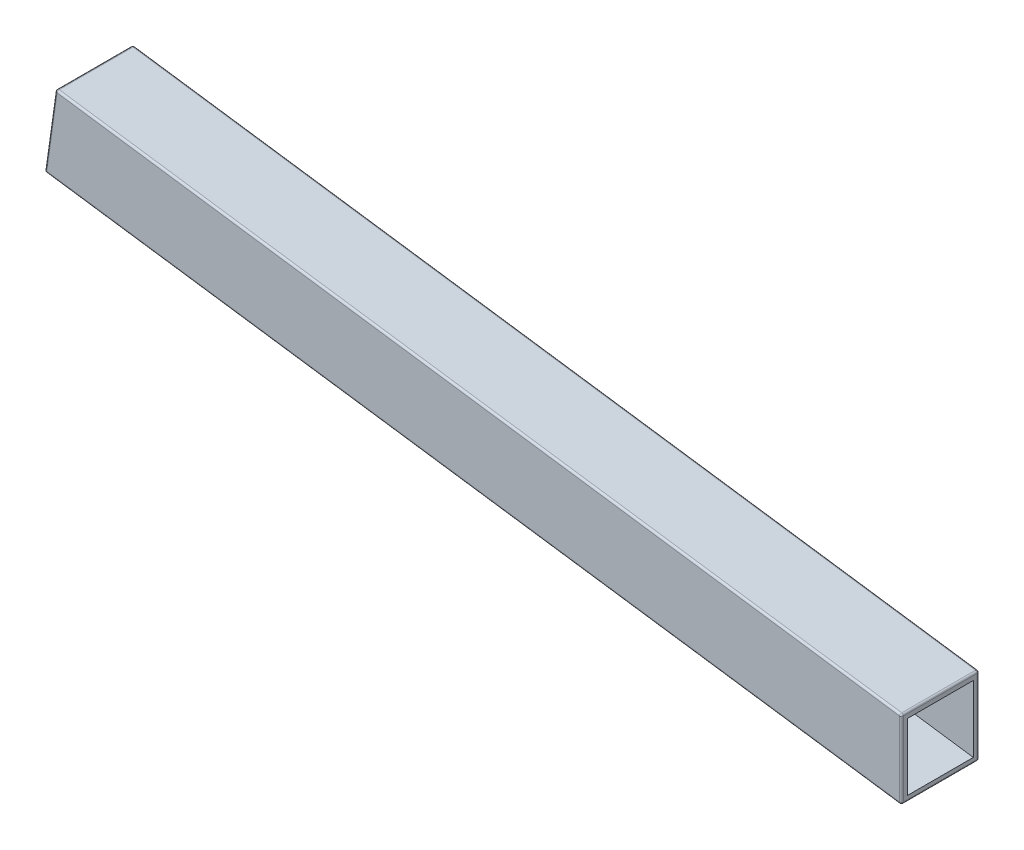
ISO-10303-21;
HEADER;
FILE_DESCRIPTION(('STEP AP214'),'2;1');
FILE_NAME('part.step','',(''),(''),'','','');
FILE_SCHEMA(('AUTOMOTIVE_DESIGN { 1 0 10303 214 1 1 1 1 }'));
ENDSEC;
DATA;
#1=APPLICATION_CONTEXT('core data for automotive mechanical design processes');
#2=APPLICATION_PROTOCOL_DEFINITION('international standard','automotive_design',2000,#1);
#3=PRODUCT_CONTEXT('',#1,'mechanical');
#4=PRODUCT('Part','Part','',(#3));
#5=PRODUCT_RELATED_PRODUCT_CATEGORY('part','',(#4));
#6=PRODUCT_DEFINITION_FORMATION('','',#4);
#7=PRODUCT_DEFINITION_CONTEXT('part definition',#1,'design');
#8=PRODUCT_DEFINITION('design','',#6,#7);
#9=PRODUCT_DEFINITION_SHAPE('','',#8);
#10=(LENGTH_UNIT() NAMED_UNIT(*) SI_UNIT(.MILLI.,.METRE.));
#11=(NAMED_UNIT(*) PLANE_ANGLE_UNIT() SI_UNIT($,.RADIAN.));
#12=(NAMED_UNIT(*) SI_UNIT($,.STERADIAN.) SOLID_ANGLE_UNIT());
#13=UNCERTAINTY_MEASURE_WITH_UNIT(LENGTH_MEASURE(1.E-05),#10,'distance_accuracy_value','');
#14=(GEOMETRIC_REPRESENTATION_CONTEXT(3) GLOBAL_UNCERTAINTY_ASSIGNED_CONTEXT((#13)) GLOBAL_UNIT_ASSIGNED_CONTEXT((#10,
#11,#12)) REPRESENTATION_CONTEXT('',''));
#15=CARTESIAN_POINT('',(0.,0.,0.));
#16=DIRECTION('',(0.,0.,1.));
#17=DIRECTION('',(1.,0.,0.));
#18=AXIS2_PLACEMENT_3D('',#15,#16,#17);
#19=CARTESIAN_POINT('',(0.,40.3931029007447,40.));
#20=DIRECTION('',(-1.,0.,0.));
#21=DIRECTION('',(0.,-1.,0.));
#22=AXIS2_PLACEMENT_3D('',#19,#20,#21);
#23=PLANE('',#22);
#24=DIRECTION('',(0.,1.,0.));
#25=VECTOR('',#24,1.);
#26=CARTESIAN_POINT('',(0.,40.3931029007447,39.));
#27=LINE('',#26,#25);
#28=CARTESIAN_POINT('',(0.,39.5238161629285,39.));
#29=VERTEX_POINT('',#28);
#30=CARTESIAN_POINT('',(0.,1.15036840722101,39.));
#31=VERTEX_POINT('',#30);
#32=EDGE_CURVE('E213',#29,#31,#27,.F.);
#33=ORIENTED_EDGE('',*,*,#32,.T.);
#34=DIRECTION('',(0.,0.,-1.));
#35=VECTOR('',#34,1.);
#36=CARTESIAN_POINT('',(0.,1.15036840722101,40.));
#37=LINE('',#36,#35);
#38=CARTESIAN_POINT('',(0.,1.15036840722101,1.));
#39=VERTEX_POINT('',#38);
#40=EDGE_CURVE('E219',#31,#39,#37,.T.);
#41=ORIENTED_EDGE('',*,*,#40,.T.);
#42=DIRECTION('',(0.,1.,0.));
#43=VECTOR('',#42,1.);
#44=CARTESIAN_POINT('',(0.,40.3931029007447,1.));
#45=LINE('',#44,#43);
#46=CARTESIAN_POINT('',(0.,39.5238161629285,1.));
#47=VERTEX_POINT('',#46);
#48=EDGE_CURVE('E217',#39,#47,#45,.T.);
#49=ORIENTED_EDGE('',*,*,#48,.T.);
#50=DIRECTION('',(0.,0.,-1.));
#51=VECTOR('',#50,1.);
#52=CARTESIAN_POINT('',(0.,39.5238161629285,40.));
#53=LINE('',#52,#51);
#54=EDGE_CURVE('E215',#47,#29,#53,.F.);
#55=ORIENTED_EDGE('',*,*,#54,.T.);
#56=EDGE_LOOP('',(#33,#41,#49,#55));
#57=FACE_BOUND('',#56,.T.);
#58=DIRECTION('',(0.,0.,-1.));
#59=VECTOR('',#58,1.);
#60=CARTESIAN_POINT('',(0.,37.3636201831886,40.));
#61=LINE('',#60,#59);
#62=CARTESIAN_POINT('',(0.,37.3636201831886,37.));
#63=VERTEX_POINT('',#62);
#64=CARTESIAN_POINT('',(0.,37.3636201831886,3.));
#65=VERTEX_POINT('',#64);
#66=EDGE_CURVE('E189',#63,#65,#61,.T.);
#67=ORIENTED_EDGE('',*,*,#66,.T.);
#68=DIRECTION('',(0.,-1.,0.));
#69=VECTOR('',#68,1.);
#70=CARTESIAN_POINT('',(0.,40.3931029007447,3.));
#71=LINE('',#70,#69);
#72=CARTESIAN_POINT('',(0.,3.02948271755558,3.));
#73=VERTEX_POINT('',#72);
#74=EDGE_CURVE('E192',#65,#73,#71,.T.);
#75=ORIENTED_EDGE('',*,*,#74,.T.);
#76=DIRECTION('',(0.,0.,1.));
#77=VECTOR('',#76,1.);
#78=CARTESIAN_POINT('',(0.,3.02948271755557,40.));
#79=LINE('',#78,#77);
#80=CARTESIAN_POINT('',(0.,3.02948271755557,37.));
#81=VERTEX_POINT('',#80);
#82=EDGE_CURVE('E184',#73,#81,#79,.T.);
#83=ORIENTED_EDGE('',*,*,#82,.T.);
#84=DIRECTION('',(0.,1.,0.));
#85=VECTOR('',#84,1.);
#86=CARTESIAN_POINT('',(0.,40.3931029007447,37.));
#87=LINE('',#86,#85);
#88=EDGE_CURVE('E160',#81,#63,#87,.T.);
#89=ORIENTED_EDGE('',*,*,#88,.T.);
#90=EDGE_LOOP('',(#67,#75,#83,#89));
#91=FACE_BOUND('',#90,.T.);
#92=ADVANCED_FACE('F39',(#57,#91),#23,.F.);
#93=CARTESIAN_POINT('',(-435.717950246291,101.629267323174,40.));
#94=DIRECTION('',(-0.139173100960065,-0.99026806874157,0.));
#95=DIRECTION('',(0.99026806874157,-0.139173100960065,0.));
#96=AXIS2_PLACEMENT_3D('',#93,#94,#95);
#97=PLANE('',#96);
#98=DIRECTION('',(0.,0.,-1.));
#99=VECTOR('',#98,1.);
#100=CARTESIAN_POINT('',(-0.860826899039935,40.5140842316701,40.));
#101=LINE('',#100,#99);
#102=CARTESIAN_POINT('',(-0.860826899039935,40.5140842316701,39.));
#103=VERTEX_POINT('',#102);
#104=CARTESIAN_POINT('',(-0.860826899039935,40.5140842316701,1.));
#105=VERTEX_POINT('',#104);
#106=EDGE_CURVE('E235',#103,#105,#101,.T.);
#107=ORIENTED_EDGE('',*,*,#106,.T.);
#108=DIRECTION('',(-0.99026806874157,0.139173100960065,0.));
#109=VECTOR('',#108,1.);
#110=CARTESIAN_POINT('',(-435.717950246291,101.629267323174,1.));
#111=LINE('',#110,#109);
#112=CARTESIAN_POINT('',(-434.727682177549,101.490094222213,1.));
#113=VERTEX_POINT('',#112);
#114=EDGE_CURVE('E238',#105,#113,#111,.T.);
#115=ORIENTED_EDGE('',*,*,#114,.T.);
#116=DIRECTION('',(0.,0.,-1.));
#117=VECTOR('',#116,1.);
#118=CARTESIAN_POINT('',(-434.727682177549,101.490094222213,40.));
#119=LINE('',#118,#117);
#120=CARTESIAN_POINT('',(-434.727682177549,101.490094222213,39.));
#121=VERTEX_POINT('',#120);
#122=EDGE_CURVE('E233',#113,#121,#119,.F.);
#123=ORIENTED_EDGE('',*,*,#122,.T.);
#124=DIRECTION('',(-0.99026806874157,0.139173100960065,0.));
#125=VECTOR('',#124,1.);
#126=CARTESIAN_POINT('',(-435.717950246291,101.629267323174,39.));
#127=LINE('',#126,#125);
#128=EDGE_CURVE('E231',#121,#103,#127,.F.);
#129=ORIENTED_EDGE('',*,*,#128,.T.);
#130=EDGE_LOOP('',(#107,#115,#123,#129));
#131=FACE_BOUND('',#130,.T.);
#132=ADVANCED_FACE('F322',(#131),#97,.F.);
#133=CARTESIAN_POINT('',(-441.284874284694,62.0185445735107,40.));
#134=DIRECTION('',(0.99026806874157,-0.139173100960066,0.));
#135=DIRECTION('',(0.139173100960066,0.99026806874157,0.));
#136=AXIS2_PLACEMENT_3D('',#133,#134,#135);
#137=PLANE('',#136);
#138=DIRECTION('',(-0.139173100960066,-0.99026806874157,0.));
#139=VECTOR('',#138,1.);
#140=CARTESIAN_POINT('',(-441.284874284694,62.0185445735107,1.));
#141=LINE('',#140,#139);
#142=CARTESIAN_POINT('',(-435.857123347251,100.638999254432,1.));
#143=VERTEX_POINT('',#142);
#144=CARTESIAN_POINT('',(-441.145701183733,63.0088126422523,1.));
#145=VERTEX_POINT('',#144);
#146=EDGE_CURVE('E208',#143,#145,#141,.T.);
#147=ORIENTED_EDGE('',*,*,#146,.T.);
#148=DIRECTION('',(0.,0.,-1.));
#149=VECTOR('',#148,1.);
#150=CARTESIAN_POINT('',(-441.145701183733,63.0088126422523,40.));
#151=LINE('',#150,#149);
#152=CARTESIAN_POINT('',(-441.145701183733,63.0088126422523,39.));
#153=VERTEX_POINT('',#152);
#154=EDGE_CURVE('E210',#145,#153,#151,.F.);
#155=ORIENTED_EDGE('',*,*,#154,.T.);
#156=DIRECTION('',(-0.139173100960066,-0.99026806874157,0.));
#157=VECTOR('',#156,1.);
#158=CARTESIAN_POINT('',(-441.284874284694,62.0185445735107,39.));
#159=LINE('',#158,#157);
#160=CARTESIAN_POINT('',(-435.857123347251,100.638999254432,39.));
#161=VERTEX_POINT('',#160);
#162=EDGE_CURVE('E204',#153,#161,#159,.F.);
#163=ORIENTED_EDGE('',*,*,#162,.T.);
#164=DIRECTION('',(0.,0.,-1.));
#165=VECTOR('',#164,1.);
#166=CARTESIAN_POINT('',(-435.857123347251,100.638999254432,40.));
#167=LINE('',#166,#165);
#168=EDGE_CURVE('E206',#161,#143,#167,.T.);
#169=ORIENTED_EDGE('',*,*,#168,.T.);
#170=EDGE_LOOP('',(#147,#155,#163,#169));
#171=FACE_BOUND('',#170,.T.);
#172=DIRECTION('',(0.,0.,1.));
#173=VECTOR('',#172,1.);
#174=CARTESIAN_POINT('',(-440.867354981813,64.9893487797355,37.));
#175=LINE('',#174,#173);
#176=CARTESIAN_POINT('',(-440.867354981813,64.9893487797355,3.));
#177=VERTEX_POINT('',#176);
#178=CARTESIAN_POINT('',(-440.867354981813,64.9893487797355,37.));
#179=VERTEX_POINT('',#178);
#180=EDGE_CURVE('E168',#177,#179,#175,.T.);
#181=ORIENTED_EDGE('',*,*,#180,.F.);
#182=DIRECTION('',(-0.139173100960066,-0.99026806874157,0.));
#183=VECTOR('',#182,1.);
#184=CARTESIAN_POINT('',(-440.867354981813,64.9893487797355,3.));
#185=LINE('',#184,#183);
#186=CARTESIAN_POINT('',(-436.135469549171,98.6584631169489,3.));
#187=VERTEX_POINT('',#186);
#188=EDGE_CURVE('E173',#187,#177,#185,.T.);
#189=ORIENTED_EDGE('',*,*,#188,.F.);
#190=DIRECTION('',(0.,0.,-1.));
#191=VECTOR('',#190,1.);
#192=CARTESIAN_POINT('',(-436.135469549171,98.6584631169489,3.));
#193=LINE('',#192,#191);
#194=CARTESIAN_POINT('',(-436.135469549171,98.6584631169489,37.));
#195=VERTEX_POINT('',#194);
#196=EDGE_CURVE('E177',#195,#187,#193,.T.);
#197=ORIENTED_EDGE('',*,*,#196,.F.);
#198=DIRECTION('',(0.139173100960066,0.99026806874157,0.));
#199=VECTOR('',#198,1.);
#200=CARTESIAN_POINT('',(-436.135469549171,98.6584631169489,37.));
#201=LINE('',#200,#199);
#202=EDGE_CURVE('E157',#179,#195,#201,.T.);
#203=ORIENTED_EDGE('',*,*,#202,.F.);
#204=EDGE_LOOP('',(#181,#189,#197,#203));
#205=FACE_BOUND('',#204,.T.);
#206=ADVANCED_FACE('F175',(#171,#205),#137,.F.);
#207=CARTESIAN_POINT('',(0.,0.,40.));
#208=DIRECTION('',(0.139173100960065,0.99026806874157,0.));
#209=DIRECTION('',(-0.99026806874157,0.139173100960065,0.));
#210=AXIS2_PLACEMENT_3D('',#207,#208,#209);
#211=PLANE('',#210);
#212=DIRECTION('',(0.,0.,-1.));
#213=VECTOR('',#212,1.);
#214=CARTESIAN_POINT('',(-440.294606215952,61.8793714725506,40.));
#215=LINE('',#214,#213);
#216=CARTESIAN_POINT('',(-440.294606215952,61.8793714725506,39.));
#217=VERTEX_POINT('',#216);
#218=CARTESIAN_POINT('',(-440.294606215952,61.8793714725506,1.));
#219=VERTEX_POINT('',#218);
#220=EDGE_CURVE('E199',#217,#219,#215,.T.);
#221=ORIENTED_EDGE('',*,*,#220,.T.);
#222=DIRECTION('',(0.99026806874157,-0.139173100960065,0.));
#223=VECTOR('',#222,1.);
#224=CARTESIAN_POINT('',(0.,0.,1.));
#225=LINE('',#224,#223);
#226=CARTESIAN_POINT('',(-1.13917310096006,0.160100338479439,1.));
#227=VERTEX_POINT('',#226);
#228=EDGE_CURVE('E202',#219,#227,#225,.T.);
#229=ORIENTED_EDGE('',*,*,#228,.T.);
#230=DIRECTION('',(0.,0.,-1.));
#231=VECTOR('',#230,1.);
#232=CARTESIAN_POINT('',(-1.13917310096006,0.160100338479439,40.));
#233=LINE('',#232,#231);
#234=CARTESIAN_POINT('',(-1.13917310096006,0.160100338479439,39.));
#235=VERTEX_POINT('',#234);
#236=EDGE_CURVE('E197',#227,#235,#233,.F.);
#237=ORIENTED_EDGE('',*,*,#236,.T.);
#238=DIRECTION('',(0.99026806874157,-0.139173100960065,0.));
#239=VECTOR('',#238,1.);
#240=CARTESIAN_POINT('',(0.,0.,39.));
#241=LINE('',#240,#239);
#242=EDGE_CURVE('E195',#235,#217,#241,.F.);
#243=ORIENTED_EDGE('',*,*,#242,.T.);
#244=EDGE_LOOP('',(#221,#229,#237,#243));
#245=FACE_BOUND('',#244,.T.);
#246=ADVANCED_FACE('F438',(#245),#211,.F.);
#247=CARTESIAN_POINT('',(0.,0.,40.));
#248=DIRECTION('',(0.,0.,-1.));
#249=DIRECTION('',(-1.,0.,0.));
#250=AXIS2_PLACEMENT_3D('',#247,#248,#249);
#251=PLANE('',#250);
#252=DIRECTION('',(-0.139173100960066,-0.99026806874157,0.));
#253=VECTOR('',#252,1.);
#254=CARTESIAN_POINT('',(-440.294606215952,61.8793714725509,40.));
#255=LINE('',#254,#253);
#256=CARTESIAN_POINT('',(-434.866855278509,100.499826153472,40.));
#257=VERTEX_POINT('',#256);
#258=CARTESIAN_POINT('',(-440.155433114992,62.8696395412922,40.));
#259=VERTEX_POINT('',#258);
#260=EDGE_CURVE('E48',#257,#259,#255,.T.);
#261=ORIENTED_EDGE('',*,*,#260,.T.);
#262=DIRECTION('',(0.99026806874157,-0.139173100960065,0.));
#263=VECTOR('',#262,1.);
#264=CARTESIAN_POINT('',(0.139173100960065,0.99026806874157,40.));
#265=LINE('',#264,#263);
#266=CARTESIAN_POINT('',(-1.,1.15036840722101,40.));
#267=VERTEX_POINT('',#266);
#268=EDGE_CURVE('E11',#259,#267,#265,.T.);
#269=ORIENTED_EDGE('',*,*,#268,.T.);
#270=DIRECTION('',(0.,1.,0.));
#271=VECTOR('',#270,1.);
#272=CARTESIAN_POINT('',(-1.,0.,40.));
#273=LINE('',#272,#271);
#274=CARTESIAN_POINT('',(-1.,39.5238161629285,40.));
#275=VERTEX_POINT('',#274);
#276=EDGE_CURVE('E240',#267,#275,#273,.T.);
#277=ORIENTED_EDGE('',*,*,#276,.T.);
#278=DIRECTION('',(-0.99026806874157,0.139173100960065,0.));
#279=VECTOR('',#278,1.);
#280=CARTESIAN_POINT('',(5.42775093744255,38.6204546809213,40.));
#281=LINE('',#280,#279);
#282=EDGE_CURVE('E59',#275,#257,#281,.T.);
#283=ORIENTED_EDGE('',*,*,#282,.T.);
#284=EDGE_LOOP('',(#261,#269,#277,#283));
#285=FACE_BOUND('',#284,.T.);
#286=ADVANCED_FACE('F435',(#285),#251,.F.);
#287=CARTESIAN_POINT('',(0.,0.,0.));
#288=DIRECTION('',(0.,0.,-1.));
#289=DIRECTION('',(-1.,0.,0.));
#290=AXIS2_PLACEMENT_3D('',#287,#288,#289);
#291=PLANE('',#290);
#292=DIRECTION('',(0.99026806874157,-0.139173100960065,0.));
#293=VECTOR('',#292,1.);
#294=CARTESIAN_POINT('',(-441.145701183734,63.0088126422523,0.));
#295=LINE('',#294,#293);
#296=CARTESIAN_POINT('',(-1.,1.150368407221,0.));
#297=VERTEX_POINT('',#296);
#298=CARTESIAN_POINT('',(-440.155433114992,62.8696395412922,0.));
#299=VERTEX_POINT('',#298);
#300=EDGE_CURVE('E226',#297,#299,#295,.F.);
#301=ORIENTED_EDGE('',*,*,#300,.T.);
#302=DIRECTION('',(-0.139173100960066,-0.99026806874157,0.));
#303=VECTOR('',#302,1.);
#304=CARTESIAN_POINT('',(-434.727682177549,101.490094222213,0.));
#305=LINE('',#304,#303);
#306=CARTESIAN_POINT('',(-434.866855278509,100.499826153472,0.));
#307=VERTEX_POINT('',#306);
#308=EDGE_CURVE('E228',#299,#307,#305,.F.);
#309=ORIENTED_EDGE('',*,*,#308,.T.);
#310=DIRECTION('',(-0.99026806874157,0.139173100960065,0.));
#311=VECTOR('',#310,1.);
#312=CARTESIAN_POINT('',(-0.139173100959955,39.4028348320032,0.));
#313=LINE('',#312,#311);
#314=CARTESIAN_POINT('',(-1.,39.5238161629285,0.));
#315=VERTEX_POINT('',#314);
#316=EDGE_CURVE('E222',#307,#315,#313,.F.);
#317=ORIENTED_EDGE('',*,*,#316,.T.);
#318=DIRECTION('',(0.,1.,0.));
#319=VECTOR('',#318,1.);
#320=CARTESIAN_POINT('',(-1.,0.,0.));
#321=LINE('',#320,#319);
#322=EDGE_CURVE('E224',#315,#297,#321,.F.);
#323=ORIENTED_EDGE('',*,*,#322,.T.);
#324=EDGE_LOOP('',(#301,#309,#317,#323));
#325=FACE_BOUND('',#324,.T.);
#326=ADVANCED_FACE('F437',(#325),#291,.T.);
#327=CARTESIAN_POINT('',(0.417519302880254,2.97080420622443,3.));
#328=DIRECTION('',(0.,0.,-1.));
#329=DIRECTION('',(0.,1.,0.));
#330=AXIS2_PLACEMENT_3D('',#327,#328,#329);
#331=PLANE('',#330);
#332=DIRECTION('',(-0.99026806874157,0.139173100960066,0.));
#333=VECTOR('',#332,1.);
#334=CARTESIAN_POINT('',(5.1494047355225,36.6399185434378,3.));
#335=LINE('',#334,#333);
#336=EDGE_CURVE('E182',#65,#187,#335,.T.);
#337=ORIENTED_EDGE('',*,*,#336,.T.);
#338=ORIENTED_EDGE('',*,*,#188,.T.);
#339=DIRECTION('',(-0.99026806874157,0.139173100960066,0.));
#340=VECTOR('',#339,1.);
#341=CARTESIAN_POINT('',(0.417519302880254,2.97080420622443,3.));
#342=LINE('',#341,#340);
#343=EDGE_CURVE('E164',#73,#177,#342,.T.);
#344=ORIENTED_EDGE('',*,*,#343,.F.);
#345=ORIENTED_EDGE('',*,*,#74,.F.);
#346=EDGE_LOOP('',(#337,#338,#344,#345));
#347=FACE_BOUND('',#346,.T.);
#348=ADVANCED_FACE('F316',(#347),#331,.F.);
#349=CARTESIAN_POINT('',(5.1494047355225,36.6399185434378,3.));
#350=DIRECTION('',(0.139173100960066,0.99026806874157,0.));
#351=DIRECTION('',(-0.99026806874157,0.139173100960066,0.));
#352=AXIS2_PLACEMENT_3D('',#349,#350,#351);
#353=PLANE('',#352);
#354=DIRECTION('',(-0.99026806874157,0.139173100960066,0.));
#355=VECTOR('',#354,1.);
#356=CARTESIAN_POINT('',(5.1494047355225,36.6399185434378,37.));
#357=LINE('',#356,#355);
#358=EDGE_CURVE('E163',#63,#195,#357,.T.);
#359=ORIENTED_EDGE('',*,*,#358,.T.);
#360=ORIENTED_EDGE('',*,*,#196,.T.);
#361=ORIENTED_EDGE('',*,*,#336,.F.);
#362=ORIENTED_EDGE('',*,*,#66,.F.);
#363=EDGE_LOOP('',(#359,#360,#361,#362));
#364=FACE_BOUND('',#363,.T.);
#365=ADVANCED_FACE('F319',(#364),#353,.F.);
#366=CARTESIAN_POINT('',(5.1494047355225,36.6399185434378,37.));
#367=DIRECTION('',(0.,0.,1.));
#368=DIRECTION('',(0.,-1.,0.));
#369=AXIS2_PLACEMENT_3D('',#366,#367,#368);
#370=PLANE('',#369);
#371=DIRECTION('',(-0.99026806874157,0.139173100960066,0.));
#372=VECTOR('',#371,1.);
#373=CARTESIAN_POINT('',(0.417519302880254,2.97080420622443,37.));
#374=LINE('',#373,#372);
#375=EDGE_CURVE('E152',#81,#179,#374,.T.);
#376=ORIENTED_EDGE('',*,*,#375,.T.);
#377=ORIENTED_EDGE('',*,*,#202,.T.);
#378=ORIENTED_EDGE('',*,*,#358,.F.);
#379=ORIENTED_EDGE('',*,*,#88,.F.);
#380=EDGE_LOOP('',(#376,#377,#378,#379));
#381=FACE_BOUND('',#380,.T.);
#382=ADVANCED_FACE('F154',(#381),#370,.F.);
#383=CARTESIAN_POINT('',(0.417519302880254,2.97080420622443,37.));
#384=DIRECTION('',(-0.139173100960066,-0.99026806874157,0.));
#385=DIRECTION('',(0.99026806874157,-0.139173100960066,0.));
#386=AXIS2_PLACEMENT_3D('',#383,#384,#385);
#387=PLANE('',#386);
#388=ORIENTED_EDGE('',*,*,#343,.T.);
#389=ORIENTED_EDGE('',*,*,#180,.T.);
#390=ORIENTED_EDGE('',*,*,#375,.F.);
#391=ORIENTED_EDGE('',*,*,#82,.F.);
#392=EDGE_LOOP('',(#388,#389,#390,#391));
#393=FACE_BOUND('',#392,.T.);
#394=ADVANCED_FACE('F169',(#393),#387,.F.);
#395=CARTESIAN_POINT('',(-1.,39.5238161629285,40.));
#396=DIRECTION('',(0.,0.,-1.));
#397=DIRECTION('',(-1.,0.,0.));
#398=AXIS2_PLACEMENT_3D('',#395,#396,#397);
#399=CYLINDRICAL_SURFACE('',#398,1.);
#400=CARTESIAN_POINT('',(-1.,39.5238161629285,39.));
#401=DIRECTION('',(0.,0.,1.));
#402=DIRECTION('',(1.,0.,0.));
#403=AXIS2_PLACEMENT_3D('',#400,#401,#402);
#404=CIRCLE('',#403,1.);
#405=EDGE_CURVE('E43',#29,#103,#404,.T.);
#406=ORIENTED_EDGE('',*,*,#405,.F.);
#407=ORIENTED_EDGE('',*,*,#54,.F.);
#408=CARTESIAN_POINT('',(-1.,39.5238161629285,1.));
#409=DIRECTION('',(0.,0.,-1.));
#410=DIRECTION('',(-1.,0.,0.));
#411=AXIS2_PLACEMENT_3D('',#408,#409,#410);
#412=CIRCLE('',#411,1.);
#413=EDGE_CURVE('E304',#105,#47,#412,.T.);
#414=ORIENTED_EDGE('',*,*,#413,.F.);
#415=ORIENTED_EDGE('',*,*,#106,.F.);
#416=EDGE_LOOP('',(#406,#407,#414,#415));
#417=FACE_BOUND('',#416,.T.);
#418=ADVANCED_FACE('F41',(#417),#399,.T.);
#419=CARTESIAN_POINT('',(-1.,39.5238161629285,39.));
#420=DIRECTION('',(0.,0.,1.));
#421=DIRECTION('',(1.,0.,0.));
#422=AXIS2_PLACEMENT_3D('',#419,#420,#421);
#423=SPHERICAL_SURFACE('',#422,1.);
#424=CARTESIAN_POINT('',(-1.,39.5238161629285,39.));
#425=DIRECTION('',(0.,1.,0.));
#426=DIRECTION('',(-1.,0.,0.));
#427=AXIS2_PLACEMENT_3D('',#424,#425,#426);
#428=CIRCLE('',#427,1.);
#429=EDGE_CURVE('E299',#29,#275,#428,.F.);
#430=ORIENTED_EDGE('',*,*,#429,.F.);
#431=ORIENTED_EDGE('',*,*,#405,.T.);
#432=CARTESIAN_POINT('',(-1.,39.5238161629285,39.));
#433=DIRECTION('',(0.99026806874157,-0.139173100960066,0.));
#434=DIRECTION('',(0.139173100960065,0.99026806874157,0.));
#435=AXIS2_PLACEMENT_3D('',#432,#433,#434);
#436=CIRCLE('',#435,1.);
#437=EDGE_CURVE('E302',#275,#103,#436,.F.);
#438=ORIENTED_EDGE('',*,*,#437,.F.);
#439=EDGE_LOOP('',(#430,#431,#438));
#440=FACE_BOUND('',#439,.T.);
#441=ADVANCED_FACE('F402',(#440),#423,.T.);
#442=CARTESIAN_POINT('',(-1.,39.5238161629285,1.));
#443=DIRECTION('',(0.,0.,1.));
#444=DIRECTION('',(1.,0.,0.));
#445=AXIS2_PLACEMENT_3D('',#442,#443,#444);
#446=SPHERICAL_SURFACE('',#445,1.);
#447=CARTESIAN_POINT('',(-1.,39.5238161629285,1.));
#448=DIRECTION('',(0.99026806874157,-0.139173100960063,0.));
#449=DIRECTION('',(0.139173100960063,0.990268068741571,0.));
#450=AXIS2_PLACEMENT_3D('',#447,#448,#449);
#451=CIRCLE('',#450,1.);
#452=EDGE_CURVE('E293',#105,#315,#451,.F.);
#453=ORIENTED_EDGE('',*,*,#452,.F.);
#454=ORIENTED_EDGE('',*,*,#413,.T.);
#455=CARTESIAN_POINT('',(-1.,39.5238161629285,1.));
#456=DIRECTION('',(0.,1.,0.));
#457=DIRECTION('',(0.,0.,1.));
#458=AXIS2_PLACEMENT_3D('',#455,#456,#457);
#459=CIRCLE('',#458,1.);
#460=EDGE_CURVE('E296',#315,#47,#459,.F.);
#461=ORIENTED_EDGE('',*,*,#460,.F.);
#462=EDGE_LOOP('',(#453,#454,#461));
#463=FACE_BOUND('',#462,.T.);
#464=ADVANCED_FACE('F399',(#463),#446,.T.);
#465=CARTESIAN_POINT('',(5.42775093744255,38.6204546809213,39.));
#466=DIRECTION('',(-0.99026806874157,0.139173100960065,0.));
#467=DIRECTION('',(-0.139173100960065,-0.99026806874157,0.));
#468=AXIS2_PLACEMENT_3D('',#465,#466,#467);
#469=CYLINDRICAL_SURFACE('',#468,1.);
#470=ORIENTED_EDGE('',*,*,#437,.T.);
#471=ORIENTED_EDGE('',*,*,#128,.F.);
#472=CARTESIAN_POINT('',(-434.866855278509,100.499826153472,39.));
#473=DIRECTION('',(-0.99026806874157,0.139173100960066,0.));
#474=DIRECTION('',(-0.139173100960066,-0.99026806874157,0.));
#475=AXIS2_PLACEMENT_3D('',#472,#473,#474);
#476=CIRCLE('',#475,1.);
#477=EDGE_CURVE('E287',#257,#121,#476,.T.);
#478=ORIENTED_EDGE('',*,*,#477,.F.);
#479=ORIENTED_EDGE('',*,*,#282,.F.);
#480=EDGE_LOOP('',(#470,#471,#478,#479));
#481=FACE_BOUND('',#480,.T.);
#482=ADVANCED_FACE('F395',(#481),#469,.T.);
#483=CARTESIAN_POINT('',(-1.,0.,39.));
#484=DIRECTION('',(0.,1.,0.));
#485=DIRECTION('',(-1.,0.,0.));
#486=AXIS2_PLACEMENT_3D('',#483,#484,#485);
#487=CYLINDRICAL_SURFACE('',#486,1.);
#488=ORIENTED_EDGE('',*,*,#429,.T.);
#489=ORIENTED_EDGE('',*,*,#276,.F.);
#490=CARTESIAN_POINT('',(-1.,1.15036840722101,39.));
#491=DIRECTION('',(0.,-1.,0.));
#492=DIRECTION('',(0.,0.,-1.));
#493=AXIS2_PLACEMENT_3D('',#490,#491,#492);
#494=CIRCLE('',#493,1.);
#495=EDGE_CURVE('E284',#31,#267,#494,.T.);
#496=ORIENTED_EDGE('',*,*,#495,.F.);
#497=ORIENTED_EDGE('',*,*,#32,.F.);
#498=EDGE_LOOP('',(#488,#489,#496,#497));
#499=FACE_BOUND('',#498,.T.);
#500=ADVANCED_FACE('F391',(#499),#487,.T.);
#501=CARTESIAN_POINT('',(-1.,1.15036840722101,40.));
#502=DIRECTION('',(0.,0.,-1.));
#503=DIRECTION('',(-1.,0.,0.));
#504=AXIS2_PLACEMENT_3D('',#501,#502,#503);
#505=CYLINDRICAL_SURFACE('',#504,1.);
#506=CARTESIAN_POINT('',(-1.,1.15036840722101,1.));
#507=DIRECTION('',(0.,0.,-1.));
#508=DIRECTION('',(-1.,0.,0.));
#509=AXIS2_PLACEMENT_3D('',#506,#507,#508);
#510=CIRCLE('',#509,1.);
#511=EDGE_CURVE('E278',#39,#227,#510,.T.);
#512=ORIENTED_EDGE('',*,*,#511,.F.);
#513=ORIENTED_EDGE('',*,*,#40,.F.);
#514=CARTESIAN_POINT('',(-1.,1.15036840722101,39.));
#515=DIRECTION('',(0.,0.,1.));
#516=DIRECTION('',(1.,0.,0.));
#517=AXIS2_PLACEMENT_3D('',#514,#515,#516);
#518=CIRCLE('',#517,1.);
#519=EDGE_CURVE('E281',#235,#31,#518,.T.);
#520=ORIENTED_EDGE('',*,*,#519,.F.);
#521=ORIENTED_EDGE('',*,*,#236,.F.);
#522=EDGE_LOOP('',(#512,#513,#520,#521));
#523=FACE_BOUND('',#522,.T.);
#524=ADVANCED_FACE('F387',(#523),#505,.T.);
#525=CARTESIAN_POINT('',(-1.,40.3931029007447,1.));
#526=DIRECTION('',(0.,-1.,0.));
#527=DIRECTION('',(1.,0.,0.));
#528=AXIS2_PLACEMENT_3D('',#525,#526,#527);
#529=CYLINDRICAL_SURFACE('',#528,1.);
#530=ORIENTED_EDGE('',*,*,#460,.T.);
#531=ORIENTED_EDGE('',*,*,#48,.F.);
#532=CARTESIAN_POINT('',(-1.,1.150368407221,1.));
#533=DIRECTION('',(0.,-1.,0.));
#534=DIRECTION('',(1.,0.,0.));
#535=AXIS2_PLACEMENT_3D('',#532,#533,#534);
#536=CIRCLE('',#535,1.);
#537=EDGE_CURVE('E276',#297,#39,#536,.T.);
#538=ORIENTED_EDGE('',*,*,#537,.F.);
#539=ORIENTED_EDGE('',*,*,#322,.F.);
#540=EDGE_LOOP('',(#530,#531,#538,#539));
#541=FACE_BOUND('',#540,.T.);
#542=ADVANCED_FACE('F383',(#541),#529,.T.);
#543=CARTESIAN_POINT('',(-435.857123347251,100.638999254432,1.));
#544=DIRECTION('',(0.99026806874157,-0.139173100960065,0.));
#545=DIRECTION('',(0.139173100960065,0.99026806874157,0.));
#546=AXIS2_PLACEMENT_3D('',#543,#544,#545);
#547=CYLINDRICAL_SURFACE('',#546,1.);
#548=ORIENTED_EDGE('',*,*,#452,.T.);
#549=ORIENTED_EDGE('',*,*,#316,.F.);
#550=CARTESIAN_POINT('',(-434.866855278509,100.499826153472,1.));
#551=DIRECTION('',(-0.99026806874157,0.139173100960066,0.));
#552=DIRECTION('',(-0.139173100960066,-0.99026806874157,0.));
#553=AXIS2_PLACEMENT_3D('',#550,#551,#552);
#554=CIRCLE('',#553,1.);
#555=EDGE_CURVE('E273',#113,#307,#554,.T.);
#556=ORIENTED_EDGE('',*,*,#555,.F.);
#557=ORIENTED_EDGE('',*,*,#114,.F.);
#558=EDGE_LOOP('',(#548,#549,#556,#557));
#559=FACE_BOUND('',#558,.T.);
#560=ADVANCED_FACE('F379',(#559),#547,.T.);
#561=CARTESIAN_POINT('',(-434.866855278509,100.499826153472,40.));
#562=DIRECTION('',(0.,0.,-1.));
#563=DIRECTION('',(-1.,0.,0.));
#564=AXIS2_PLACEMENT_3D('',#561,#562,#563);
#565=CYLINDRICAL_SURFACE('',#564,1.);
#566=CARTESIAN_POINT('',(-434.866855278509,100.499826153472,39.));
#567=DIRECTION('',(0.,0.,1.));
#568=DIRECTION('',(1.,0.,0.));
#569=AXIS2_PLACEMENT_3D('',#566,#567,#568);
#570=CIRCLE('',#569,1.);
#571=EDGE_CURVE('E290',#121,#161,#570,.T.);
#572=ORIENTED_EDGE('',*,*,#571,.F.);
#573=ORIENTED_EDGE('',*,*,#122,.F.);
#574=CARTESIAN_POINT('',(-434.866855278509,100.499826153472,1.));
#575=DIRECTION('',(0.,0.,-1.));
#576=DIRECTION('',(-1.,0.,0.));
#577=AXIS2_PLACEMENT_3D('',#574,#575,#576);
#578=CIRCLE('',#577,1.);
#579=EDGE_CURVE('E270',#143,#113,#578,.T.);
#580=ORIENTED_EDGE('',*,*,#579,.F.);
#581=ORIENTED_EDGE('',*,*,#168,.F.);
#582=EDGE_LOOP('',(#572,#573,#580,#581));
#583=FACE_BOUND('',#582,.T.);
#584=ADVANCED_FACE('F375',(#583),#565,.T.);
#585=CARTESIAN_POINT('',(-434.866855278509,100.499826153472,39.));
#586=DIRECTION('',(0.,0.,1.));
#587=DIRECTION('',(1.,0.,0.));
#588=AXIS2_PLACEMENT_3D('',#585,#586,#587);
#589=SPHERICAL_SURFACE('',#588,1.);
#590=ORIENTED_EDGE('',*,*,#477,.T.);
#591=ORIENTED_EDGE('',*,*,#571,.T.);
#592=CARTESIAN_POINT('',(-434.866855278509,100.499826153472,39.));
#593=DIRECTION('',(0.139173100960064,0.990268068741571,0.));
#594=DIRECTION('',(-0.990268068741571,0.139173100960064,0.));
#595=AXIS2_PLACEMENT_3D('',#592,#593,#594);
#596=CIRCLE('',#595,1.);
#597=EDGE_CURVE('E267',#257,#161,#596,.F.);
#598=ORIENTED_EDGE('',*,*,#597,.F.);
#599=EDGE_LOOP('',(#590,#591,#598));
#600=FACE_BOUND('',#599,.T.);
#601=ADVANCED_FACE('F371',(#600),#589,.T.);
#602=CARTESIAN_POINT('',(-1.,1.15036840722101,39.));
#603=DIRECTION('',(0.,0.,1.));
#604=DIRECTION('',(1.,0.,0.));
#605=AXIS2_PLACEMENT_3D('',#602,#603,#604);
#606=SPHERICAL_SURFACE('',#605,1.);
#607=ORIENTED_EDGE('',*,*,#519,.T.);
#608=ORIENTED_EDGE('',*,*,#495,.T.);
#609=CARTESIAN_POINT('',(-1.,1.15036840722101,39.));
#610=DIRECTION('',(0.99026806874157,-0.139173100960065,0.));
#611=DIRECTION('',(0.139173100960065,0.99026806874157,0.));
#612=AXIS2_PLACEMENT_3D('',#609,#610,#611);
#613=CIRCLE('',#612,1.);
#614=EDGE_CURVE('E265',#235,#267,#613,.F.);
#615=ORIENTED_EDGE('',*,*,#614,.F.);
#616=EDGE_LOOP('',(#607,#608,#615));
#617=FACE_BOUND('',#616,.T.);
#618=ADVANCED_FACE('F367',(#617),#606,.T.);
#619=CARTESIAN_POINT('',(-1.,1.15036840722101,1.));
#620=DIRECTION('',(0.,0.,1.));
#621=DIRECTION('',(1.,0.,0.));
#622=AXIS2_PLACEMENT_3D('',#619,#620,#621);
#623=SPHERICAL_SURFACE('',#622,1.);
#624=ORIENTED_EDGE('',*,*,#537,.T.);
#625=ORIENTED_EDGE('',*,*,#511,.T.);
#626=CARTESIAN_POINT('',(-1.,1.15036840722101,1.));
#627=DIRECTION('',(0.99026806874157,-0.139173100960065,0.));
#628=DIRECTION('',(0.139173100960065,0.99026806874157,0.));
#629=AXIS2_PLACEMENT_3D('',#626,#627,#628);
#630=CIRCLE('',#629,1.);
#631=EDGE_CURVE('E262',#297,#227,#630,.F.);
#632=ORIENTED_EDGE('',*,*,#631,.F.);
#633=EDGE_LOOP('',(#624,#625,#632));
#634=FACE_BOUND('',#633,.T.);
#635=ADVANCED_FACE('F363',(#634),#623,.T.);
#636=CARTESIAN_POINT('',(-434.866855278509,100.499826153472,1.));
#637=DIRECTION('',(0.,0.,1.));
#638=DIRECTION('',(1.,0.,0.));
#639=AXIS2_PLACEMENT_3D('',#636,#637,#638);
#640=SPHERICAL_SURFACE('',#639,1.);
#641=ORIENTED_EDGE('',*,*,#579,.T.);
#642=ORIENTED_EDGE('',*,*,#555,.T.);
#643=CARTESIAN_POINT('',(-434.866855278509,100.499826153472,1.));
#644=DIRECTION('',(0.139173100960064,0.990268068741571,0.));
#645=DIRECTION('',(-0.990268068741571,0.139173100960064,0.));
#646=AXIS2_PLACEMENT_3D('',#643,#644,#645);
#647=CIRCLE('',#646,1.);
#648=EDGE_CURVE('E260',#143,#307,#647,.F.);
#649=ORIENTED_EDGE('',*,*,#648,.F.);
#650=EDGE_LOOP('',(#641,#642,#649));
#651=FACE_BOUND('',#650,.T.);
#652=ADVANCED_FACE('F359',(#651),#640,.T.);
#653=CARTESIAN_POINT('',(-440.294606215952,61.8793714725509,39.));
#654=DIRECTION('',(-0.139173100960066,-0.99026806874157,0.));
#655=DIRECTION('',(0.99026806874157,-0.139173100960066,0.));
#656=AXIS2_PLACEMENT_3D('',#653,#654,#655);
#657=CYLINDRICAL_SURFACE('',#656,1.);
#658=ORIENTED_EDGE('',*,*,#597,.T.);
#659=ORIENTED_EDGE('',*,*,#162,.F.);
#660=CARTESIAN_POINT('',(-440.155433114992,62.8696395412922,39.));
#661=DIRECTION('',(-0.139173100960078,-0.990268068741569,0.));
#662=DIRECTION('',(0.990268068741569,-0.139173100960078,0.));
#663=AXIS2_PLACEMENT_3D('',#660,#661,#662);
#664=CIRCLE('',#663,1.);
#665=EDGE_CURVE('E257',#259,#153,#664,.T.);
#666=ORIENTED_EDGE('',*,*,#665,.F.);
#667=ORIENTED_EDGE('',*,*,#260,.F.);
#668=EDGE_LOOP('',(#658,#659,#666,#667));
#669=FACE_BOUND('',#668,.T.);
#670=ADVANCED_FACE('F355',(#669),#657,.T.);
#671=CARTESIAN_POINT('',(0.139173100960065,0.99026806874157,39.));
#672=DIRECTION('',(0.99026806874157,-0.139173100960065,0.));
#673=DIRECTION('',(0.139173100960065,0.99026806874157,0.));
#674=AXIS2_PLACEMENT_3D('',#671,#672,#673);
#675=CYLINDRICAL_SURFACE('',#674,1.);
#676=ORIENTED_EDGE('',*,*,#614,.T.);
#677=ORIENTED_EDGE('',*,*,#268,.F.);
#678=CARTESIAN_POINT('',(-440.155433114992,62.8696395412922,39.));
#679=DIRECTION('',(-0.99026806874157,0.139173100960066,0.));
#680=DIRECTION('',(-0.139173100960066,-0.99026806874157,0.));
#681=AXIS2_PLACEMENT_3D('',#678,#679,#680);
#682=CIRCLE('',#681,1.);
#683=EDGE_CURVE('E254',#217,#259,#682,.T.);
#684=ORIENTED_EDGE('',*,*,#683,.F.);
#685=ORIENTED_EDGE('',*,*,#242,.F.);
#686=EDGE_LOOP('',(#676,#677,#684,#685));
#687=FACE_BOUND('',#686,.T.);
#688=ADVANCED_FACE('F351',(#687),#675,.T.);
#689=CARTESIAN_POINT('',(0.139173100960065,0.99026806874157,1.));
#690=DIRECTION('',(-0.99026806874157,0.139173100960065,0.));
#691=DIRECTION('',(-0.139173100960065,-0.99026806874157,0.));
#692=AXIS2_PLACEMENT_3D('',#689,#690,#691);
#693=CYLINDRICAL_SURFACE('',#692,1.);
#694=ORIENTED_EDGE('',*,*,#631,.T.);
#695=ORIENTED_EDGE('',*,*,#228,.F.);
#696=CARTESIAN_POINT('',(-440.155433114992,62.8696395412922,1.));
#697=DIRECTION('',(-0.990268068741578,0.139173100960012,0.));
#698=DIRECTION('',(-0.139173100960012,-0.990268068741578,0.));
#699=AXIS2_PLACEMENT_3D('',#696,#697,#698);
#700=CIRCLE('',#699,1.);
#701=EDGE_CURVE('E251',#299,#219,#700,.T.);
#702=ORIENTED_EDGE('',*,*,#701,.F.);
#703=ORIENTED_EDGE('',*,*,#300,.F.);
#704=EDGE_LOOP('',(#694,#695,#702,#703));
#705=FACE_BOUND('',#704,.T.);
#706=ADVANCED_FACE('F347',(#705),#693,.T.);
#707=CARTESIAN_POINT('',(-440.294606215952,61.8793714725506,1.));
#708=DIRECTION('',(0.139173100960066,0.99026806874157,0.));
#709=DIRECTION('',(-0.99026806874157,0.139173100960066,0.));
#710=AXIS2_PLACEMENT_3D('',#707,#708,#709);
#711=CYLINDRICAL_SURFACE('',#710,1.);
#712=ORIENTED_EDGE('',*,*,#648,.T.);
#713=ORIENTED_EDGE('',*,*,#308,.F.);
#714=CARTESIAN_POINT('',(-440.155433114992,62.8696395412922,1.));
#715=DIRECTION('',(-0.139173100960064,-0.990268068741571,0.));
#716=DIRECTION('',(0.990268068741571,-0.139173100960064,0.));
#717=AXIS2_PLACEMENT_3D('',#714,#715,#716);
#718=CIRCLE('',#717,1.);
#719=EDGE_CURVE('E248',#145,#299,#718,.T.);
#720=ORIENTED_EDGE('',*,*,#719,.F.);
#721=ORIENTED_EDGE('',*,*,#146,.F.);
#722=EDGE_LOOP('',(#712,#713,#720,#721));
#723=FACE_BOUND('',#722,.T.);
#724=ADVANCED_FACE('F343',(#723),#711,.T.);
#725=CARTESIAN_POINT('',(-440.155433114992,62.8696395412922,39.));
#726=DIRECTION('',(0.,0.,1.));
#727=DIRECTION('',(1.,0.,0.));
#728=AXIS2_PLACEMENT_3D('',#725,#726,#727);
#729=SPHERICAL_SURFACE('',#728,1.);
#730=ORIENTED_EDGE('',*,*,#683,.T.);
#731=ORIENTED_EDGE('',*,*,#665,.T.);
#732=CARTESIAN_POINT('',(-440.155433114992,62.8696395412922,39.));
#733=DIRECTION('',(0.,0.,1.));
#734=DIRECTION('',(1.,0.,0.));
#735=AXIS2_PLACEMENT_3D('',#732,#733,#734);
#736=CIRCLE('',#735,1.);
#737=EDGE_CURVE('E246',#217,#153,#736,.F.);
#738=ORIENTED_EDGE('',*,*,#737,.F.);
#739=EDGE_LOOP('',(#730,#731,#738));
#740=FACE_BOUND('',#739,.T.);
#741=ADVANCED_FACE('F339',(#740),#729,.T.);
#742=CARTESIAN_POINT('',(-440.155433114992,62.8696395412922,1.));
#743=DIRECTION('',(0.,0.,1.));
#744=DIRECTION('',(1.,0.,0.));
#745=AXIS2_PLACEMENT_3D('',#742,#743,#744);
#746=SPHERICAL_SURFACE('',#745,1.);
#747=ORIENTED_EDGE('',*,*,#719,.T.);
#748=ORIENTED_EDGE('',*,*,#701,.T.);
#749=CARTESIAN_POINT('',(-440.155433114992,62.8696395412922,1.));
#750=DIRECTION('',(0.,0.,-1.));
#751=DIRECTION('',(-1.,0.,0.));
#752=AXIS2_PLACEMENT_3D('',#749,#750,#751);
#753=CIRCLE('',#752,1.);
#754=EDGE_CURVE('E244',#145,#219,#753,.F.);
#755=ORIENTED_EDGE('',*,*,#754,.F.);
#756=EDGE_LOOP('',(#747,#748,#755));
#757=FACE_BOUND('',#756,.T.);
#758=ADVANCED_FACE('F335',(#757),#746,.T.);
#759=CARTESIAN_POINT('',(-440.155433114992,62.8696395412922,40.));
#760=DIRECTION('',(0.,0.,-1.));
#761=DIRECTION('',(-1.,0.,0.));
#762=AXIS2_PLACEMENT_3D('',#759,#760,#761);
#763=CYLINDRICAL_SURFACE('',#762,1.);
#764=ORIENTED_EDGE('',*,*,#737,.T.);
#765=ORIENTED_EDGE('',*,*,#154,.F.);
#766=ORIENTED_EDGE('',*,*,#754,.T.);
#767=ORIENTED_EDGE('',*,*,#220,.F.);
#768=EDGE_LOOP('',(#764,#765,#766,#767));
#769=FACE_BOUND('',#768,.T.);
#770=ADVANCED_FACE('F332',(#769),#763,.T.);
#771=CLOSED_SHELL('',(#92,#132,#206,#246,#286,#326,#348,#365,#382,#394,#418,#441,#464,#482,#500,
#524,#542,#560,#584,#601,#618,#635,#652,#670,#688,#706,#724,#741,#758,#770));
#772=MANIFOLD_SOLID_BREP('B2',#771);
#773=ADVANCED_BREP_SHAPE_REPRESENTATION('',(#18,#772),#14);
#774=SHAPE_DEFINITION_REPRESENTATION(#9,#773);
ENDSEC;
END-ISO-10303-21;
